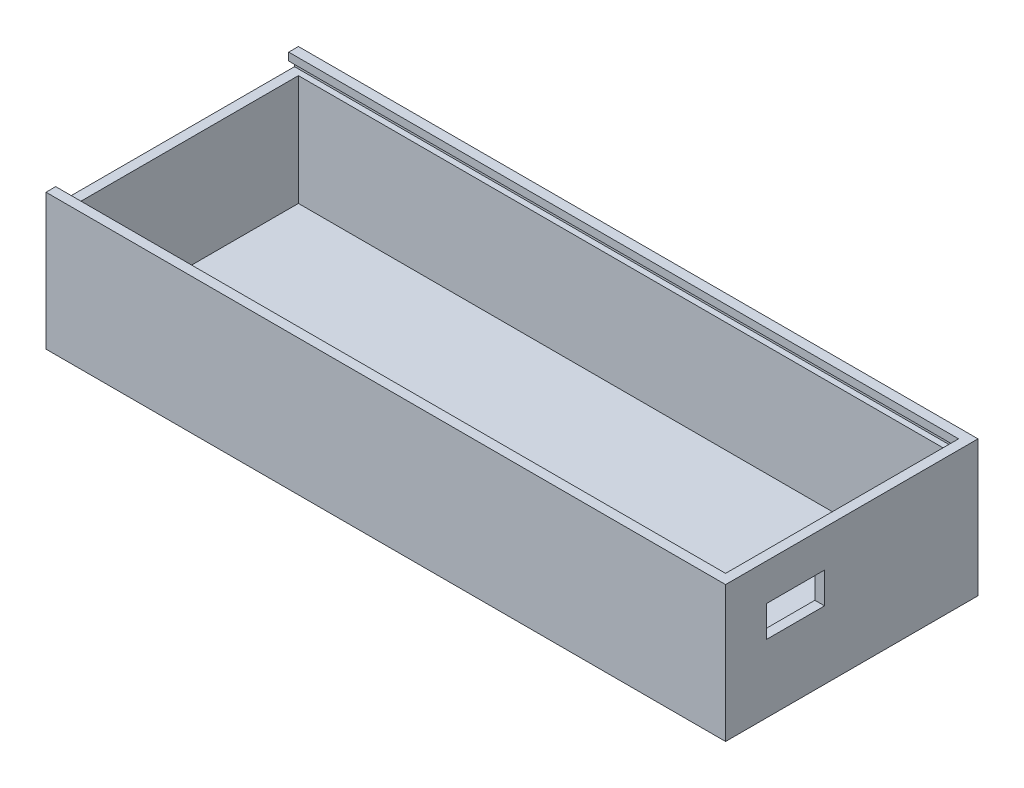
ISO-10303-21;
HEADER;
FILE_DESCRIPTION(('STEP AP214'),'2;1');
FILE_NAME('part.step','',(''),(''),'','','');
FILE_SCHEMA(('AUTOMOTIVE_DESIGN { 1 0 10303 214 1 1 1 1 }'));
ENDSEC;
DATA;
#1=APPLICATION_CONTEXT('core data for automotive mechanical design processes');
#2=APPLICATION_PROTOCOL_DEFINITION('international standard','automotive_design',2000,#1);
#3=PRODUCT_CONTEXT('',#1,'mechanical');
#4=PRODUCT('Part','Part','',(#3));
#5=PRODUCT_RELATED_PRODUCT_CATEGORY('part','',(#4));
#6=PRODUCT_DEFINITION_FORMATION('','',#4);
#7=PRODUCT_DEFINITION_CONTEXT('part definition',#1,'design');
#8=PRODUCT_DEFINITION('design','',#6,#7);
#9=PRODUCT_DEFINITION_SHAPE('','',#8);
#10=(LENGTH_UNIT() NAMED_UNIT(*) SI_UNIT(.MILLI.,.METRE.));
#11=(NAMED_UNIT(*) PLANE_ANGLE_UNIT() SI_UNIT($,.RADIAN.));
#12=(NAMED_UNIT(*) SI_UNIT($,.STERADIAN.) SOLID_ANGLE_UNIT());
#13=UNCERTAINTY_MEASURE_WITH_UNIT(LENGTH_MEASURE(1.E-05),#10,'distance_accuracy_value','');
#14=(GEOMETRIC_REPRESENTATION_CONTEXT(3) GLOBAL_UNCERTAINTY_ASSIGNED_CONTEXT((#13)) GLOBAL_UNIT_ASSIGNED_CONTEXT((#10,
#11,#12)) REPRESENTATION_CONTEXT('',''));
#15=CARTESIAN_POINT('',(0.,0.,0.));
#16=DIRECTION('',(0.,0.,1.));
#17=DIRECTION('',(1.,0.,0.));
#18=AXIS2_PLACEMENT_3D('',#15,#16,#17);
#19=CARTESIAN_POINT('',(-89.1047938915139,2.5,-57.1685820340766));
#20=DIRECTION('',(0.,0.,-1.));
#21=DIRECTION('',(-1.,0.,0.));
#22=AXIS2_PLACEMENT_3D('',#19,#20,#21);
#23=PLANE('',#22);
#24=DIRECTION('',(-1.,0.,0.));
#25=VECTOR('',#24,1.);
#26=CARTESIAN_POINT('',(-89.1047938915139,35.,-57.1685820340766));
#27=LINE('',#26,#25);
#28=CARTESIAN_POINT('',(80.8952061084861,35.,-57.1685820340766));
#29=VERTEX_POINT('',#28);
#30=CARTESIAN_POINT('',(-91.6047938915139,35.,-57.1685820340766));
#31=VERTEX_POINT('',#30);
#32=EDGE_CURVE('E281',#29,#31,#27,.T.);
#33=ORIENTED_EDGE('',*,*,#32,.T.);
#34=DIRECTION('',(0.,-1.,0.));
#35=VECTOR('',#34,1.);
#36=CARTESIAN_POINT('',(-91.6047938915139,35.,-57.1685820340766));
#37=LINE('',#36,#35);
#38=CARTESIAN_POINT('',(-91.6047938915139,33.,-57.1685820340766));
#39=VERTEX_POINT('',#38);
#40=EDGE_CURVE('E199',#31,#39,#37,.T.);
#41=ORIENTED_EDGE('',*,*,#40,.T.);
#42=DIRECTION('',(1.,0.,0.));
#43=VECTOR('',#42,1.);
#44=CARTESIAN_POINT('',(-89.1047938915139,33.,-57.1685820340766));
#45=LINE('',#44,#43);
#46=CARTESIAN_POINT('',(80.8952061084861,33.,-57.1685820340766));
#47=VERTEX_POINT('',#46);
#48=EDGE_CURVE('E61',#39,#47,#45,.T.);
#49=ORIENTED_EDGE('',*,*,#48,.T.);
#50=DIRECTION('',(0.,1.,0.));
#51=VECTOR('',#50,1.);
#52=CARTESIAN_POINT('',(80.8952061084861,2.5,-57.1685820340766));
#53=LINE('',#52,#51);
#54=EDGE_CURVE('E311',#47,#29,#53,.T.);
#55=ORIENTED_EDGE('',*,*,#54,.T.);
#56=EDGE_LOOP('',(#33,#41,#49,#55));
#57=FACE_BOUND('',#56,.T.);
#58=ADVANCED_FACE('F45',(#57),#23,.F.);
#59=CARTESIAN_POINT('',(80.8952061084861,2.5,-57.1685820340766));
#60=DIRECTION('',(1.,0.,0.));
#61=DIRECTION('',(0.,0.,-1.));
#62=AXIS2_PLACEMENT_3D('',#59,#60,#61);
#63=PLANE('',#62);
#64=ORIENTED_EDGE('',*,*,#54,.F.);
#65=DIRECTION('',(0.,0.,1.));
#66=VECTOR('',#65,1.);
#67=CARTESIAN_POINT('',(80.8952061084861,33.,-57.1685820340766));
#68=LINE('',#67,#66);
#69=CARTESIAN_POINT('',(80.8952061084861,33.,2.83141796592339));
#70=VERTEX_POINT('',#69);
#71=EDGE_CURVE('E242',#47,#70,#68,.T.);
#72=ORIENTED_EDGE('',*,*,#71,.T.);
#73=DIRECTION('',(0.,1.,0.));
#74=VECTOR('',#73,1.);
#75=CARTESIAN_POINT('',(80.8952061084861,2.5,2.83141796592339));
#76=LINE('',#75,#74);
#77=CARTESIAN_POINT('',(80.8952061084861,35.,2.83141796592339));
#78=VERTEX_POINT('',#77);
#79=EDGE_CURVE('E188',#70,#78,#76,.T.);
#80=ORIENTED_EDGE('',*,*,#79,.T.);
#81=DIRECTION('',(0.,0.,-1.));
#82=VECTOR('',#81,1.);
#83=CARTESIAN_POINT('',(80.8952061084861,35.,-57.1685820340766));
#84=LINE('',#83,#82);
#85=EDGE_CURVE('E296',#78,#29,#84,.T.);
#86=ORIENTED_EDGE('',*,*,#85,.T.);
#87=EDGE_LOOP('',(#64,#72,#80,#86));
#88=FACE_BOUND('',#87,.T.);
#89=ADVANCED_FACE('F401',(#88),#63,.F.);
#90=CARTESIAN_POINT('',(-89.1047938915139,2.5,2.83141796592339));
#91=DIRECTION('',(0.,0.,1.));
#92=DIRECTION('',(1.,0.,0.));
#93=AXIS2_PLACEMENT_3D('',#90,#91,#92);
#94=PLANE('',#93);
#95=ORIENTED_EDGE('',*,*,#79,.F.);
#96=DIRECTION('',(-1.,0.,0.));
#97=VECTOR('',#96,1.);
#98=CARTESIAN_POINT('',(-89.1047938915139,33.,2.83141796592339));
#99=LINE('',#98,#97);
#100=CARTESIAN_POINT('',(-91.6047938915139,33.,2.83141796592339));
#101=VERTEX_POINT('',#100);
#102=EDGE_CURVE('E11',#70,#101,#99,.T.);
#103=ORIENTED_EDGE('',*,*,#102,.T.);
#104=DIRECTION('',(0.,1.,0.));
#105=VECTOR('',#104,1.);
#106=CARTESIAN_POINT('',(-91.6047938915139,35.,2.83141796592338));
#107=LINE('',#106,#105);
#108=CARTESIAN_POINT('',(-91.6047938915139,35.,2.83141796592338));
#109=VERTEX_POINT('',#108);
#110=EDGE_CURVE('E186',#101,#109,#107,.T.);
#111=ORIENTED_EDGE('',*,*,#110,.T.);
#112=DIRECTION('',(1.,0.,0.));
#113=VECTOR('',#112,1.);
#114=CARTESIAN_POINT('',(-89.1047938915139,35.,2.83141796592339));
#115=LINE('',#114,#113);
#116=EDGE_CURVE('E275',#109,#78,#115,.T.);
#117=ORIENTED_EDGE('',*,*,#116,.T.);
#118=EDGE_LOOP('',(#95,#103,#111,#117));
#119=FACE_BOUND('',#118,.T.);
#120=ADVANCED_FACE('F184',(#119),#94,.F.);
#121=CARTESIAN_POINT('',(-91.6047938915139,35.,-59.6685820340766));
#122=DIRECTION('',(1.,0.,0.));
#123=DIRECTION('',(0.,0.,-1.));
#124=AXIS2_PLACEMENT_3D('',#121,#122,#123);
#125=PLANE('',#124);
#126=DIRECTION('',(0.,0.,-1.));
#127=VECTOR('',#126,1.);
#128=CARTESIAN_POINT('',(-91.6047938915139,33.,-58.6685820340766));
#129=LINE('',#128,#127);
#130=CARTESIAN_POINT('',(-91.6047938915139,33.,-58.6685820340766));
#131=VERTEX_POINT('',#130);
#132=EDGE_CURVE('E207',#39,#131,#129,.T.);
#133=ORIENTED_EDGE('',*,*,#132,.F.);
#134=ORIENTED_EDGE('',*,*,#40,.F.);
#135=DIRECTION('',(0.,0.,1.));
#136=VECTOR('',#135,1.);
#137=CARTESIAN_POINT('',(-91.6047938915139,35.,-59.6685820340766));
#138=LINE('',#137,#136);
#139=CARTESIAN_POINT('',(-91.6047938915139,35.,-59.6685820340766));
#140=VERTEX_POINT('',#139);
#141=EDGE_CURVE('E319',#140,#31,#138,.T.);
#142=ORIENTED_EDGE('',*,*,#141,.F.);
#143=DIRECTION('',(0.,-1.,0.));
#144=VECTOR('',#143,1.);
#145=CARTESIAN_POINT('',(-91.6047938915139,35.,-59.6685820340766));
#146=LINE('',#145,#144);
#147=CARTESIAN_POINT('',(-91.6047938915139,0.,-59.6685820340766));
#148=VERTEX_POINT('',#147);
#149=EDGE_CURVE('E332',#140,#148,#146,.T.);
#150=ORIENTED_EDGE('',*,*,#149,.T.);
#151=DIRECTION('',(0.,0.,1.));
#152=VECTOR('',#151,1.);
#153=CARTESIAN_POINT('',(-91.6047938915139,0.,-59.6685820340766));
#154=LINE('',#153,#152);
#155=CARTESIAN_POINT('',(-91.6047938915139,0.,5.33141796592339));
#156=VERTEX_POINT('',#155);
#157=EDGE_CURVE('E306',#148,#156,#154,.T.);
#158=ORIENTED_EDGE('',*,*,#157,.T.);
#159=DIRECTION('',(0.,-1.,0.));
#160=VECTOR('',#159,1.);
#161=CARTESIAN_POINT('',(-91.6047938915139,35.,5.33141796592339));
#162=LINE('',#161,#160);
#163=CARTESIAN_POINT('',(-91.6047938915139,35.,5.33141796592339));
#164=VERTEX_POINT('',#163);
#165=EDGE_CURVE('E356',#164,#156,#162,.T.);
#166=ORIENTED_EDGE('',*,*,#165,.F.);
#167=EDGE_CURVE('E197',#109,#164,#138,.T.);
#168=ORIENTED_EDGE('',*,*,#167,.F.);
#169=ORIENTED_EDGE('',*,*,#110,.F.);
#170=CARTESIAN_POINT('',(-91.6047938915139,33.,4.33141796592339));
#171=VERTEX_POINT('',#170);
#172=EDGE_CURVE('E195',#171,#101,#129,.T.);
#173=ORIENTED_EDGE('',*,*,#172,.F.);
#174=DIRECTION('',(0.,1.,0.));
#175=VECTOR('',#174,1.);
#176=CARTESIAN_POINT('',(-91.6047938915139,33.,4.33141796592339));
#177=LINE('',#176,#175);
#178=CARTESIAN_POINT('',(-91.6047938915139,31.,4.33141796592339));
#179=VERTEX_POINT('',#178);
#180=EDGE_CURVE('E214',#179,#171,#177,.T.);
#181=ORIENTED_EDGE('',*,*,#180,.F.);
#182=DIRECTION('',(0.,0.,1.));
#183=VECTOR('',#182,1.);
#184=CARTESIAN_POINT('',(-91.6047938915139,31.,-58.6685820340766));
#185=LINE('',#184,#183);
#186=CARTESIAN_POINT('',(-91.6047938915139,31.,-58.6685820340766));
#187=VERTEX_POINT('',#186);
#188=EDGE_CURVE('E453',#187,#179,#185,.T.);
#189=ORIENTED_EDGE('',*,*,#188,.F.);
#190=DIRECTION('',(0.,-1.,0.));
#191=VECTOR('',#190,1.);
#192=CARTESIAN_POINT('',(-91.6047938915139,33.,-58.6685820340766));
#193=LINE('',#192,#191);
#194=EDGE_CURVE('E69',#131,#187,#193,.T.);
#195=ORIENTED_EDGE('',*,*,#194,.F.);
#196=EDGE_LOOP('',(#133,#134,#142,#150,#158,#166,#168,#169,#173,#181,#189,#195));
#197=FACE_BOUND('',#196,.T.);
#198=ADVANCED_FACE('F47',(#197),#125,.F.);
#199=CARTESIAN_POINT('',(-91.6047938915139,35.,5.33141796592339));
#200=DIRECTION('',(0.,0.,-1.));
#201=DIRECTION('',(-1.,0.,0.));
#202=AXIS2_PLACEMENT_3D('',#199,#200,#201);
#203=PLANE('',#202);
#204=DIRECTION('',(1.,0.,0.));
#205=VECTOR('',#204,1.);
#206=CARTESIAN_POINT('',(-91.6047938915139,0.,5.33141796592339));
#207=LINE('',#206,#205);
#208=CARTESIAN_POINT('',(83.3952061084861,0.,5.33141796592339));
#209=VERTEX_POINT('',#208);
#210=EDGE_CURVE('E336',#156,#209,#207,.T.);
#211=ORIENTED_EDGE('',*,*,#210,.T.);
#212=DIRECTION('',(0.,-1.,0.));
#213=VECTOR('',#212,1.);
#214=CARTESIAN_POINT('',(83.3952061084861,35.,5.33141796592339));
#215=LINE('',#214,#213);
#216=CARTESIAN_POINT('',(83.3952061084861,35.,5.33141796592339));
#217=VERTEX_POINT('',#216);
#218=EDGE_CURVE('E352',#217,#209,#215,.T.);
#219=ORIENTED_EDGE('',*,*,#218,.F.);
#220=DIRECTION('',(1.,0.,0.));
#221=VECTOR('',#220,1.);
#222=CARTESIAN_POINT('',(-91.6047938915139,35.,5.33141796592339));
#223=LINE('',#222,#221);
#224=EDGE_CURVE('E323',#164,#217,#223,.T.);
#225=ORIENTED_EDGE('',*,*,#224,.F.);
#226=ORIENTED_EDGE('',*,*,#165,.T.);
#227=EDGE_LOOP('',(#211,#219,#225,#226));
#228=FACE_BOUND('',#227,.T.);
#229=ADVANCED_FACE('F435',(#228),#203,.F.);
#230=CARTESIAN_POINT('',(83.3952061084861,35.,-59.6685820340766));
#231=DIRECTION('',(-1.,0.,0.));
#232=DIRECTION('',(0.,0.,1.));
#233=AXIS2_PLACEMENT_3D('',#230,#231,#232);
#234=PLANE('',#233);
#235=DIRECTION('',(0.,1.,0.));
#236=VECTOR('',#235,1.);
#237=CARTESIAN_POINT('',(83.3952061084861,25.5,-20.1685820340766));
#238=LINE('',#237,#236);
#239=CARTESIAN_POINT('',(83.3952061084861,17.5,-20.1685820340766));
#240=VERTEX_POINT('',#239);
#241=CARTESIAN_POINT('',(83.3952061084861,25.5,-20.1685820340766));
#242=VERTEX_POINT('',#241);
#243=EDGE_CURVE('E252',#240,#242,#238,.T.);
#244=ORIENTED_EDGE('',*,*,#243,.F.);
#245=DIRECTION('',(0.,0.,-1.));
#246=VECTOR('',#245,1.);
#247=CARTESIAN_POINT('',(83.3952061084861,17.5,-5.16858203407662));
#248=LINE('',#247,#246);
#249=CARTESIAN_POINT('',(83.3952061084861,17.5,-5.16858203407662));
#250=VERTEX_POINT('',#249);
#251=EDGE_CURVE('E256',#250,#240,#248,.T.);
#252=ORIENTED_EDGE('',*,*,#251,.F.);
#253=DIRECTION('',(0.,-1.,0.));
#254=VECTOR('',#253,1.);
#255=CARTESIAN_POINT('',(83.3952061084861,25.5,-5.16858203407661));
#256=LINE('',#255,#254);
#257=CARTESIAN_POINT('',(83.3952061084861,25.5,-5.16858203407662));
#258=VERTEX_POINT('',#257);
#259=EDGE_CURVE('E247',#258,#250,#256,.T.);
#260=ORIENTED_EDGE('',*,*,#259,.F.);
#261=DIRECTION('',(0.,0.,1.));
#262=VECTOR('',#261,1.);
#263=CARTESIAN_POINT('',(83.3952061084861,25.5,-5.16858203407661));
#264=LINE('',#263,#262);
#265=EDGE_CURVE('E248',#242,#258,#264,.T.);
#266=ORIENTED_EDGE('',*,*,#265,.F.);
#267=EDGE_LOOP('',(#244,#252,#260,#266));
#268=FACE_BOUND('',#267,.T.);
#269=DIRECTION('',(0.,0.,-1.));
#270=VECTOR('',#269,1.);
#271=CARTESIAN_POINT('',(83.3952061084861,0.,-59.6685820340766));
#272=LINE('',#271,#270);
#273=CARTESIAN_POINT('',(83.3952061084861,0.,-59.6685820340766));
#274=VERTEX_POINT('',#273);
#275=EDGE_CURVE('E339',#209,#274,#272,.T.);
#276=ORIENTED_EDGE('',*,*,#275,.T.);
#277=DIRECTION('',(0.,-1.,0.));
#278=VECTOR('',#277,1.);
#279=CARTESIAN_POINT('',(83.3952061084861,35.,-59.6685820340766));
#280=LINE('',#279,#278);
#281=CARTESIAN_POINT('',(83.3952061084861,35.,-59.6685820340766));
#282=VERTEX_POINT('',#281);
#283=EDGE_CURVE('E348',#282,#274,#280,.T.);
#284=ORIENTED_EDGE('',*,*,#283,.F.);
#285=DIRECTION('',(0.,0.,-1.));
#286=VECTOR('',#285,1.);
#287=CARTESIAN_POINT('',(83.3952061084861,35.,-59.6685820340766));
#288=LINE('',#287,#286);
#289=EDGE_CURVE('E326',#217,#282,#288,.T.);
#290=ORIENTED_EDGE('',*,*,#289,.F.);
#291=ORIENTED_EDGE('',*,*,#218,.T.);
#292=EDGE_LOOP('',(#276,#284,#290,#291));
#293=FACE_BOUND('',#292,.T.);
#294=ADVANCED_FACE('F505',(#268,#293),#234,.F.);
#295=CARTESIAN_POINT('',(-91.6047938915139,35.,-59.6685820340766));
#296=DIRECTION('',(0.,0.,1.));
#297=DIRECTION('',(1.,0.,0.));
#298=AXIS2_PLACEMENT_3D('',#295,#296,#297);
#299=PLANE('',#298);
#300=DIRECTION('',(-1.,0.,0.));
#301=VECTOR('',#300,1.);
#302=CARTESIAN_POINT('',(-91.6047938915139,0.,-59.6685820340766));
#303=LINE('',#302,#301);
#304=EDGE_CURVE('E342',#274,#148,#303,.T.);
#305=ORIENTED_EDGE('',*,*,#304,.T.);
#306=ORIENTED_EDGE('',*,*,#149,.F.);
#307=DIRECTION('',(-1.,0.,0.));
#308=VECTOR('',#307,1.);
#309=CARTESIAN_POINT('',(-91.6047938915139,35.,-59.6685820340766));
#310=LINE('',#309,#308);
#311=EDGE_CURVE('E329',#282,#140,#310,.T.);
#312=ORIENTED_EDGE('',*,*,#311,.F.);
#313=ORIENTED_EDGE('',*,*,#283,.T.);
#314=EDGE_LOOP('',(#305,#306,#312,#313));
#315=FACE_BOUND('',#314,.T.);
#316=ADVANCED_FACE('F427',(#315),#299,.F.);
#317=CARTESIAN_POINT('',(0.,35.,0.));
#318=DIRECTION('',(0.,1.,0.));
#319=DIRECTION('',(0.,0.,1.));
#320=AXIS2_PLACEMENT_3D('',#317,#318,#319);
#321=PLANE('',#320);
#322=ORIENTED_EDGE('',*,*,#141,.T.);
#323=ORIENTED_EDGE('',*,*,#32,.F.);
#324=ORIENTED_EDGE('',*,*,#85,.F.);
#325=ORIENTED_EDGE('',*,*,#116,.F.);
#326=ORIENTED_EDGE('',*,*,#167,.T.);
#327=ORIENTED_EDGE('',*,*,#224,.T.);
#328=ORIENTED_EDGE('',*,*,#289,.T.);
#329=ORIENTED_EDGE('',*,*,#311,.T.);
#330=EDGE_LOOP('',(#322,#323,#324,#325,#326,#327,#328,#329));
#331=FACE_BOUND('',#330,.T.);
#332=ADVANCED_FACE('F421',(#331),#321,.T.);
#333=CARTESIAN_POINT('',(0.,0.,0.));
#334=DIRECTION('',(0.,1.,0.));
#335=DIRECTION('',(0.,0.,1.));
#336=AXIS2_PLACEMENT_3D('',#333,#334,#335);
#337=PLANE('',#336);
#338=ORIENTED_EDGE('',*,*,#157,.F.);
#339=ORIENTED_EDGE('',*,*,#304,.F.);
#340=ORIENTED_EDGE('',*,*,#275,.F.);
#341=ORIENTED_EDGE('',*,*,#210,.F.);
#342=EDGE_LOOP('',(#338,#339,#340,#341));
#343=FACE_BOUND('',#342,.T.);
#344=ADVANCED_FACE('F402',(#343),#337,.F.);
#345=CARTESIAN_POINT('',(-89.1047938915139,2.5,-57.1685820340766));
#346=DIRECTION('',(-1.,0.,0.));
#347=DIRECTION('',(0.,0.,1.));
#348=AXIS2_PLACEMENT_3D('',#345,#346,#347);
#349=PLANE('',#348);
#350=DIRECTION('',(0.,1.,0.));
#351=VECTOR('',#350,1.);
#352=CARTESIAN_POINT('',(-89.1047938915139,2.5,-57.1685820340766));
#353=LINE('',#352,#351);
#354=CARTESIAN_POINT('',(-89.1047938915139,2.5,-57.1685820340766));
#355=VERTEX_POINT('',#354);
#356=CARTESIAN_POINT('',(-89.1047938915139,31.,-57.1685820340766));
#357=VERTEX_POINT('',#356);
#358=EDGE_CURVE('E302',#355,#357,#353,.T.);
#359=ORIENTED_EDGE('',*,*,#358,.T.);
#360=DIRECTION('',(0.,0.,1.));
#361=VECTOR('',#360,1.);
#362=CARTESIAN_POINT('',(-89.1047938915139,31.,-57.1685820340766));
#363=LINE('',#362,#361);
#364=CARTESIAN_POINT('',(-89.1047938915139,31.,2.83141796592339));
#365=VERTEX_POINT('',#364);
#366=EDGE_CURVE('E238',#357,#365,#363,.T.);
#367=ORIENTED_EDGE('',*,*,#366,.T.);
#368=DIRECTION('',(0.,1.,0.));
#369=VECTOR('',#368,1.);
#370=CARTESIAN_POINT('',(-89.1047938915139,2.5,2.83141796592339));
#371=LINE('',#370,#369);
#372=CARTESIAN_POINT('',(-89.1047938915139,2.5,2.83141796592339));
#373=VERTEX_POINT('',#372);
#374=EDGE_CURVE('E293',#373,#365,#371,.T.);
#375=ORIENTED_EDGE('',*,*,#374,.F.);
#376=DIRECTION('',(0.,0.,1.));
#377=VECTOR('',#376,1.);
#378=CARTESIAN_POINT('',(-89.1047938915139,2.5,-57.1685820340766));
#379=LINE('',#378,#377);
#380=EDGE_CURVE('E276',#355,#373,#379,.T.);
#381=ORIENTED_EDGE('',*,*,#380,.F.);
#382=EDGE_LOOP('',(#359,#367,#375,#381));
#383=FACE_BOUND('',#382,.T.);
#384=ADVANCED_FACE('F389',(#383),#349,.F.);
#385=CARTESIAN_POINT('',(80.8952061084861,2.5,-57.1685820340766));
#386=VERTEX_POINT('',#385);
#387=CARTESIAN_POINT('',(80.8952061084861,31.,-57.1685820340766));
#388=VERTEX_POINT('',#387);
#389=EDGE_CURVE('E307',#386,#388,#53,.T.);
#390=ORIENTED_EDGE('',*,*,#389,.T.);
#391=DIRECTION('',(-1.,0.,0.));
#392=VECTOR('',#391,1.);
#393=CARTESIAN_POINT('',(-89.1047938915139,31.,-57.1685820340766));
#394=LINE('',#393,#392);
#395=EDGE_CURVE('E234',#388,#357,#394,.T.);
#396=ORIENTED_EDGE('',*,*,#395,.T.);
#397=ORIENTED_EDGE('',*,*,#358,.F.);
#398=DIRECTION('',(-1.,0.,0.));
#399=VECTOR('',#398,1.);
#400=CARTESIAN_POINT('',(-89.1047938915139,2.5,-57.1685820340766));
#401=LINE('',#400,#399);
#402=EDGE_CURVE('E289',#386,#355,#401,.T.);
#403=ORIENTED_EDGE('',*,*,#402,.F.);
#404=EDGE_LOOP('',(#390,#396,#397,#403));
#405=FACE_BOUND('',#404,.T.);
#406=ADVANCED_FACE('F392',(#405),#23,.F.);
#407=DIRECTION('',(0.,-1.,0.));
#408=VECTOR('',#407,1.);
#409=CARTESIAN_POINT('',(80.8952061084861,2.49999999999999,-5.16858203407661));
#410=LINE('',#409,#408);
#411=CARTESIAN_POINT('',(80.8952061084861,25.5,-5.16858203407661));
#412=VERTEX_POINT('',#411);
#413=CARTESIAN_POINT('',(80.8952061084861,17.5,-5.16858203407661));
#414=VERTEX_POINT('',#413);
#415=EDGE_CURVE('E360',#412,#414,#410,.T.);
#416=ORIENTED_EDGE('',*,*,#415,.T.);
#417=DIRECTION('',(0.,0.,-1.));
#418=VECTOR('',#417,1.);
#419=CARTESIAN_POINT('',(80.8952061084861,17.5,-57.1685820340766));
#420=LINE('',#419,#418);
#421=CARTESIAN_POINT('',(80.8952061084861,17.5,-20.1685820340766));
#422=VERTEX_POINT('',#421);
#423=EDGE_CURVE('E372',#414,#422,#420,.T.);
#424=ORIENTED_EDGE('',*,*,#423,.T.);
#425=DIRECTION('',(0.,1.,0.));
#426=VECTOR('',#425,1.);
#427=CARTESIAN_POINT('',(80.8952061084861,2.49999999999999,-20.1685820340766));
#428=LINE('',#427,#426);
#429=CARTESIAN_POINT('',(80.8952061084861,25.5,-20.1685820340766));
#430=VERTEX_POINT('',#429);
#431=EDGE_CURVE('E368',#422,#430,#428,.T.);
#432=ORIENTED_EDGE('',*,*,#431,.T.);
#433=DIRECTION('',(0.,0.,1.));
#434=VECTOR('',#433,1.);
#435=CARTESIAN_POINT('',(80.8952061084861,25.5,-57.1685820340766));
#436=LINE('',#435,#434);
#437=EDGE_CURVE('E364',#430,#412,#436,.T.);
#438=ORIENTED_EDGE('',*,*,#437,.T.);
#439=EDGE_LOOP('',(#416,#424,#432,#438));
#440=FACE_BOUND('',#439,.T.);
#441=CARTESIAN_POINT('',(80.8952061084861,2.5,2.83141796592339));
#442=VERTEX_POINT('',#441);
#443=CARTESIAN_POINT('',(80.8952061084861,31.,2.83141796592339));
#444=VERTEX_POINT('',#443);
#445=EDGE_CURVE('E312',#442,#444,#76,.T.);
#446=ORIENTED_EDGE('',*,*,#445,.T.);
#447=DIRECTION('',(0.,0.,-1.));
#448=VECTOR('',#447,1.);
#449=CARTESIAN_POINT('',(80.8952061084861,31.,-57.1685820340766));
#450=LINE('',#449,#448);
#451=EDGE_CURVE('E221',#444,#388,#450,.T.);
#452=ORIENTED_EDGE('',*,*,#451,.T.);
#453=ORIENTED_EDGE('',*,*,#389,.F.);
#454=DIRECTION('',(0.,0.,-1.));
#455=VECTOR('',#454,1.);
#456=CARTESIAN_POINT('',(80.8952061084861,2.5,-57.1685820340766));
#457=LINE('',#456,#455);
#458=EDGE_CURVE('E285',#442,#386,#457,.T.);
#459=ORIENTED_EDGE('',*,*,#458,.F.);
#460=EDGE_LOOP('',(#446,#452,#453,#459));
#461=FACE_BOUND('',#460,.T.);
#462=ADVANCED_FACE('F383',(#440,#461),#63,.F.);
#463=ORIENTED_EDGE('',*,*,#374,.T.);
#464=DIRECTION('',(1.,0.,0.));
#465=VECTOR('',#464,1.);
#466=CARTESIAN_POINT('',(-89.1047938915139,31.,2.83141796592339));
#467=LINE('',#466,#465);
#468=EDGE_CURVE('E54',#365,#444,#467,.T.);
#469=ORIENTED_EDGE('',*,*,#468,.T.);
#470=ORIENTED_EDGE('',*,*,#445,.F.);
#471=DIRECTION('',(1.,0.,0.));
#472=VECTOR('',#471,1.);
#473=CARTESIAN_POINT('',(-89.1047938915139,2.5,2.83141796592339));
#474=LINE('',#473,#472);
#475=EDGE_CURVE('E280',#373,#442,#474,.T.);
#476=ORIENTED_EDGE('',*,*,#475,.F.);
#477=EDGE_LOOP('',(#463,#469,#470,#476));
#478=FACE_BOUND('',#477,.T.);
#479=ADVANCED_FACE('F378',(#478),#94,.F.);
#480=CARTESIAN_POINT('',(0.,2.5,0.));
#481=DIRECTION('',(0.,1.,0.));
#482=DIRECTION('',(0.,0.,1.));
#483=AXIS2_PLACEMENT_3D('',#480,#481,#482);
#484=PLANE('',#483);
#485=ORIENTED_EDGE('',*,*,#380,.T.);
#486=ORIENTED_EDGE('',*,*,#475,.T.);
#487=ORIENTED_EDGE('',*,*,#458,.T.);
#488=ORIENTED_EDGE('',*,*,#402,.T.);
#489=EDGE_LOOP('',(#485,#486,#487,#488));
#490=FACE_BOUND('',#489,.T.);
#491=ADVANCED_FACE('F386',(#490),#484,.T.);
#492=CARTESIAN_POINT('',(-106.104793891514,17.5,-5.16858203407658));
#493=DIRECTION('',(0.,-1.,0.));
#494=DIRECTION('',(0.,0.,-1.));
#495=AXIS2_PLACEMENT_3D('',#492,#493,#494);
#496=PLANE('',#495);
#497=DIRECTION('',(1.,0.,0.));
#498=VECTOR('',#497,1.);
#499=CARTESIAN_POINT('',(-106.104793891514,17.5,-5.16858203407658));
#500=LINE('',#499,#498);
#501=EDGE_CURVE('E267',#414,#250,#500,.T.);
#502=ORIENTED_EDGE('',*,*,#501,.T.);
#503=ORIENTED_EDGE('',*,*,#251,.T.);
#504=DIRECTION('',(1.,0.,0.));
#505=VECTOR('',#504,1.);
#506=CARTESIAN_POINT('',(-106.104793891514,17.5,-20.1685820340766));
#507=LINE('',#506,#505);
#508=EDGE_CURVE('E251',#422,#240,#507,.T.);
#509=ORIENTED_EDGE('',*,*,#508,.F.);
#510=ORIENTED_EDGE('',*,*,#423,.F.);
#511=EDGE_LOOP('',(#502,#503,#509,#510));
#512=FACE_BOUND('',#511,.T.);
#513=ADVANCED_FACE('F485',(#512),#496,.F.);
#514=CARTESIAN_POINT('',(-106.104793891514,25.5,-20.1685820340766));
#515=DIRECTION('',(0.,0.,-1.));
#516=DIRECTION('',(0.,1.,0.));
#517=AXIS2_PLACEMENT_3D('',#514,#515,#516);
#518=PLANE('',#517);
#519=ORIENTED_EDGE('',*,*,#508,.T.);
#520=ORIENTED_EDGE('',*,*,#243,.T.);
#521=DIRECTION('',(1.,0.,0.));
#522=VECTOR('',#521,1.);
#523=CARTESIAN_POINT('',(-106.104793891514,25.5,-20.1685820340766));
#524=LINE('',#523,#522);
#525=EDGE_CURVE('E268',#430,#242,#524,.T.);
#526=ORIENTED_EDGE('',*,*,#525,.F.);
#527=ORIENTED_EDGE('',*,*,#431,.F.);
#528=EDGE_LOOP('',(#519,#520,#526,#527));
#529=FACE_BOUND('',#528,.T.);
#530=ADVANCED_FACE('F481',(#529),#518,.F.);
#531=CARTESIAN_POINT('',(-106.104793891514,25.5,-5.16858203407657));
#532=DIRECTION('',(0.,1.,0.));
#533=DIRECTION('',(0.,0.,1.));
#534=AXIS2_PLACEMENT_3D('',#531,#532,#533);
#535=PLANE('',#534);
#536=ORIENTED_EDGE('',*,*,#525,.T.);
#537=ORIENTED_EDGE('',*,*,#265,.T.);
#538=DIRECTION('',(1.,0.,0.));
#539=VECTOR('',#538,1.);
#540=CARTESIAN_POINT('',(-106.104793891514,25.5,-5.16858203407657));
#541=LINE('',#540,#539);
#542=EDGE_CURVE('E263',#412,#258,#541,.T.);
#543=ORIENTED_EDGE('',*,*,#542,.F.);
#544=ORIENTED_EDGE('',*,*,#437,.F.);
#545=EDGE_LOOP('',(#536,#537,#543,#544));
#546=FACE_BOUND('',#545,.T.);
#547=ADVANCED_FACE('F477',(#546),#535,.F.);
#548=CARTESIAN_POINT('',(-106.104793891514,25.5,-5.16858203407657));
#549=DIRECTION('',(0.,0.,1.));
#550=DIRECTION('',(0.,-1.,0.));
#551=AXIS2_PLACEMENT_3D('',#548,#549,#550);
#552=PLANE('',#551);
#553=ORIENTED_EDGE('',*,*,#542,.T.);
#554=ORIENTED_EDGE('',*,*,#259,.T.);
#555=ORIENTED_EDGE('',*,*,#501,.F.);
#556=ORIENTED_EDGE('',*,*,#415,.F.);
#557=EDGE_LOOP('',(#553,#554,#555,#556));
#558=FACE_BOUND('',#557,.T.);
#559=ADVANCED_FACE('F474',(#558),#552,.F.);
#560=CARTESIAN_POINT('',(81.8952061084861,33.,-58.6685820340766));
#561=DIRECTION('',(0.,1.,0.));
#562=DIRECTION('',(0.,0.,1.));
#563=AXIS2_PLACEMENT_3D('',#560,#561,#562);
#564=PLANE('',#563);
#565=ORIENTED_EDGE('',*,*,#48,.F.);
#566=ORIENTED_EDGE('',*,*,#132,.T.);
#567=DIRECTION('',(-1.,0.,0.));
#568=VECTOR('',#567,1.);
#569=CARTESIAN_POINT('',(81.8952061084861,33.,-58.6685820340766));
#570=LINE('',#569,#568);
#571=CARTESIAN_POINT('',(81.8952061084861,33.,-58.6685820340766));
#572=VERTEX_POINT('',#571);
#573=EDGE_CURVE('E218',#572,#131,#570,.T.);
#574=ORIENTED_EDGE('',*,*,#573,.F.);
#575=DIRECTION('',(0.,0.,-1.));
#576=VECTOR('',#575,1.);
#577=CARTESIAN_POINT('',(81.8952061084861,33.,-58.6685820340766));
#578=LINE('',#577,#576);
#579=CARTESIAN_POINT('',(81.8952061084861,33.,4.33141796592335));
#580=VERTEX_POINT('',#579);
#581=EDGE_CURVE('E230',#580,#572,#578,.T.);
#582=ORIENTED_EDGE('',*,*,#581,.F.);
#583=DIRECTION('',(-1.,0.,0.));
#584=VECTOR('',#583,1.);
#585=CARTESIAN_POINT('',(81.8952061084861,33.,4.33141796592335));
#586=LINE('',#585,#584);
#587=EDGE_CURVE('E203',#580,#171,#586,.T.);
#588=ORIENTED_EDGE('',*,*,#587,.T.);
#589=ORIENTED_EDGE('',*,*,#172,.T.);
#590=ORIENTED_EDGE('',*,*,#102,.F.);
#591=ORIENTED_EDGE('',*,*,#71,.F.);
#592=EDGE_LOOP('',(#565,#566,#574,#582,#588,#589,#590,#591));
#593=FACE_BOUND('',#592,.T.);
#594=ADVANCED_FACE('F201',(#593),#564,.F.);
#595=CARTESIAN_POINT('',(81.8952061084861,31.,-58.6685820340766));
#596=DIRECTION('',(0.,-1.,0.));
#597=DIRECTION('',(0.,0.,-1.));
#598=AXIS2_PLACEMENT_3D('',#595,#596,#597);
#599=PLANE('',#598);
#600=ORIENTED_EDGE('',*,*,#188,.T.);
#601=DIRECTION('',(-1.,0.,0.));
#602=VECTOR('',#601,1.);
#603=CARTESIAN_POINT('',(81.8952061084861,31.,4.33141796592335));
#604=LINE('',#603,#602);
#605=CARTESIAN_POINT('',(81.8952061084861,31.,4.33141796592335));
#606=VERTEX_POINT('',#605);
#607=EDGE_CURVE('E224',#606,#179,#604,.T.);
#608=ORIENTED_EDGE('',*,*,#607,.F.);
#609=DIRECTION('',(0.,0.,1.));
#610=VECTOR('',#609,1.);
#611=CARTESIAN_POINT('',(81.8952061084861,31.,-58.6685820340766));
#612=LINE('',#611,#610);
#613=CARTESIAN_POINT('',(81.8952061084861,31.,-58.6685820340766));
#614=VERTEX_POINT('',#613);
#615=EDGE_CURVE('E212',#614,#606,#612,.T.);
#616=ORIENTED_EDGE('',*,*,#615,.F.);
#617=DIRECTION('',(-1.,0.,0.));
#618=VECTOR('',#617,1.);
#619=CARTESIAN_POINT('',(81.8952061084861,31.,-58.6685820340766));
#620=LINE('',#619,#618);
#621=EDGE_CURVE('E227',#614,#187,#620,.T.);
#622=ORIENTED_EDGE('',*,*,#621,.T.);
#623=EDGE_LOOP('',(#600,#608,#616,#622));
#624=FACE_BOUND('',#623,.T.);
#625=ORIENTED_EDGE('',*,*,#395,.F.);
#626=ORIENTED_EDGE('',*,*,#451,.F.);
#627=ORIENTED_EDGE('',*,*,#468,.F.);
#628=ORIENTED_EDGE('',*,*,#366,.F.);
#629=EDGE_LOOP('',(#625,#626,#627,#628));
#630=FACE_BOUND('',#629,.T.);
#631=ADVANCED_FACE('F390',(#624,#630),#599,.F.);
#632=CARTESIAN_POINT('',(81.8952061084861,33.,-58.6685820340766));
#633=DIRECTION('',(0.,0.,-1.));
#634=DIRECTION('',(-1.,0.,0.));
#635=AXIS2_PLACEMENT_3D('',#632,#633,#634);
#636=PLANE('',#635);
#637=ORIENTED_EDGE('',*,*,#194,.T.);
#638=ORIENTED_EDGE('',*,*,#621,.F.);
#639=DIRECTION('',(0.,-1.,0.));
#640=VECTOR('',#639,1.);
#641=CARTESIAN_POINT('',(81.8952061084861,33.,-58.6685820340766));
#642=LINE('',#641,#640);
#643=EDGE_CURVE('E206',#572,#614,#642,.T.);
#644=ORIENTED_EDGE('',*,*,#643,.F.);
#645=ORIENTED_EDGE('',*,*,#573,.T.);
#646=EDGE_LOOP('',(#637,#638,#644,#645));
#647=FACE_BOUND('',#646,.T.);
#648=ADVANCED_FACE('F464',(#647),#636,.F.);
#649=CARTESIAN_POINT('',(81.8952061084861,33.,4.33141796592335));
#650=DIRECTION('',(0.,0.,1.));
#651=DIRECTION('',(1.,0.,0.));
#652=AXIS2_PLACEMENT_3D('',#649,#650,#651);
#653=PLANE('',#652);
#654=ORIENTED_EDGE('',*,*,#180,.T.);
#655=ORIENTED_EDGE('',*,*,#587,.F.);
#656=DIRECTION('',(0.,1.,0.));
#657=VECTOR('',#656,1.);
#658=CARTESIAN_POINT('',(81.8952061084861,33.,4.33141796592335));
#659=LINE('',#658,#657);
#660=EDGE_CURVE('E442',#606,#580,#659,.T.);
#661=ORIENTED_EDGE('',*,*,#660,.F.);
#662=ORIENTED_EDGE('',*,*,#607,.T.);
#663=EDGE_LOOP('',(#654,#655,#661,#662));
#664=FACE_BOUND('',#663,.T.);
#665=ADVANCED_FACE('F460',(#664),#653,.F.);
#666=CARTESIAN_POINT('',(81.8952061084861,0.,0.));
#667=DIRECTION('',(-1.,0.,0.));
#668=DIRECTION('',(0.,0.,1.));
#669=AXIS2_PLACEMENT_3D('',#666,#667,#668);
#670=PLANE('',#669);
#671=ORIENTED_EDGE('',*,*,#643,.T.);
#672=ORIENTED_EDGE('',*,*,#615,.T.);
#673=ORIENTED_EDGE('',*,*,#660,.T.);
#674=ORIENTED_EDGE('',*,*,#581,.T.);
#675=EDGE_LOOP('',(#671,#672,#673,#674));
#676=FACE_BOUND('',#675,.T.);
#677=ADVANCED_FACE('F463',(#676),#670,.T.);
#678=CLOSED_SHELL('',(#58,#89,#120,#198,#229,#294,#316,#332,#344,#384,#406,#462,#479,#491,#513,
#530,#547,#559,#594,#631,#648,#665,#677));
#679=MANIFOLD_SOLID_BREP('B2',#678);
#680=ADVANCED_BREP_SHAPE_REPRESENTATION('',(#18,#679),#14);
#681=SHAPE_DEFINITION_REPRESENTATION(#9,#680);
ENDSEC;
END-ISO-10303-21;
